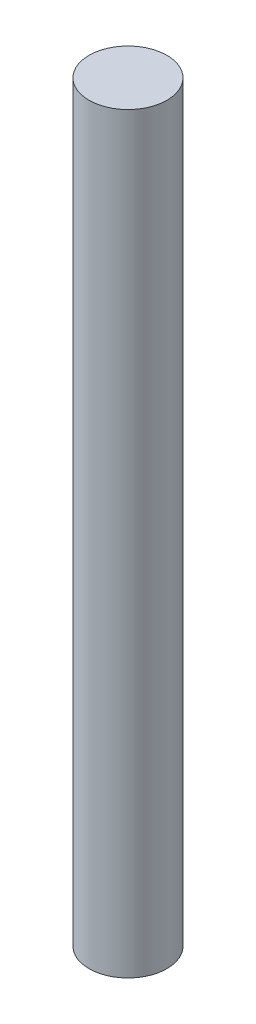
ISO-10303-21;
HEADER;
FILE_DESCRIPTION(('STEP AP214'),'2;1');
FILE_NAME('part.step','',(''),(''),'','','');
FILE_SCHEMA(('AUTOMOTIVE_DESIGN { 1 0 10303 214 1 1 1 1 }'));
ENDSEC;
DATA;
#1=APPLICATION_CONTEXT('core data for automotive mechanical design processes');
#2=APPLICATION_PROTOCOL_DEFINITION('international standard','automotive_design',2000,#1);
#3=PRODUCT_CONTEXT('',#1,'mechanical');
#4=PRODUCT('Part','Part','',(#3));
#5=PRODUCT_RELATED_PRODUCT_CATEGORY('part','',(#4));
#6=PRODUCT_DEFINITION_FORMATION('','',#4);
#7=PRODUCT_DEFINITION_CONTEXT('part definition',#1,'design');
#8=PRODUCT_DEFINITION('design','',#6,#7);
#9=PRODUCT_DEFINITION_SHAPE('','',#8);
#10=(LENGTH_UNIT() NAMED_UNIT(*) SI_UNIT(.MILLI.,.METRE.));
#11=(NAMED_UNIT(*) PLANE_ANGLE_UNIT() SI_UNIT($,.RADIAN.));
#12=(NAMED_UNIT(*) SI_UNIT($,.STERADIAN.) SOLID_ANGLE_UNIT());
#13=UNCERTAINTY_MEASURE_WITH_UNIT(LENGTH_MEASURE(1.E-05),#10,'distance_accuracy_value','');
#14=(GEOMETRIC_REPRESENTATION_CONTEXT(3) GLOBAL_UNCERTAINTY_ASSIGNED_CONTEXT((#13)) GLOBAL_UNIT_ASSIGNED_CONTEXT((#10,
#11,#12)) REPRESENTATION_CONTEXT('',''));
#15=CARTESIAN_POINT('',(0.,0.,0.));
#16=DIRECTION('',(0.,0.,1.));
#17=DIRECTION('',(1.,0.,0.));
#18=AXIS2_PLACEMENT_3D('',#15,#16,#17);
#19=CARTESIAN_POINT('',(0.,18.35,0.));
#20=DIRECTION('',(0.,-1.,0.));
#21=DIRECTION('',(0.,0.,-1.));
#22=AXIS2_PLACEMENT_3D('',#19,#20,#21);
#23=CYLINDRICAL_SURFACE('',#22,0.95);
#24=CARTESIAN_POINT('',(0.,18.35,0.));
#25=DIRECTION('',(0.,1.,0.));
#26=DIRECTION('',(0.,0.,1.));
#27=AXIS2_PLACEMENT_3D('',#24,#25,#26);
#28=CIRCLE('',#27,0.95);
#29=CARTESIAN_POINT('',(0.,18.35,0.95));
#30=VERTEX_POINT('',#29);
#31=EDGE_CURVE('E12',#30,#30,#28,.T.);
#32=ORIENTED_EDGE('',*,*,#31,.F.);
#33=EDGE_LOOP('',(#32));
#34=FACE_BOUND('',#33,.T.);
#35=CARTESIAN_POINT('',(0.,0.,0.));
#36=DIRECTION('',(0.,1.,0.));
#37=DIRECTION('',(0.,0.,1.));
#38=AXIS2_PLACEMENT_3D('',#35,#36,#37);
#39=CIRCLE('',#38,0.95);
#40=CARTESIAN_POINT('',(0.,0.,0.95));
#41=VERTEX_POINT('',#40);
#42=EDGE_CURVE('E57',#41,#41,#39,.T.);
#43=ORIENTED_EDGE('',*,*,#42,.T.);
#44=EDGE_LOOP('',(#43));
#45=FACE_BOUND('',#44,.T.);
#46=ADVANCED_FACE('F52',(#34,#45),#23,.T.);
#47=CARTESIAN_POINT('',(0.,18.35,0.));
#48=DIRECTION('',(0.,1.,0.));
#49=DIRECTION('',(0.,0.,1.));
#50=AXIS2_PLACEMENT_3D('',#47,#48,#49);
#51=PLANE('',#50);
#52=ORIENTED_EDGE('',*,*,#31,.T.);
#53=EDGE_LOOP('',(#52));
#54=FACE_BOUND('',#53,.T.);
#55=ADVANCED_FACE('F68',(#54),#51,.T.);
#56=CARTESIAN_POINT('',(0.,0.,0.));
#57=DIRECTION('',(0.,1.,0.));
#58=DIRECTION('',(0.,0.,1.));
#59=AXIS2_PLACEMENT_3D('',#56,#57,#58);
#60=PLANE('',#59);
#61=ORIENTED_EDGE('',*,*,#42,.F.);
#62=EDGE_LOOP('',(#61));
#63=FACE_BOUND('',#62,.T.);
#64=ADVANCED_FACE('F66',(#63),#60,.F.);
#65=CLOSED_SHELL('',(#46,#55,#64));
#66=MANIFOLD_SOLID_BREP('B2',#65);
#67=ADVANCED_BREP_SHAPE_REPRESENTATION('',(#18,#66),#14);
#68=SHAPE_DEFINITION_REPRESENTATION(#9,#67);
ENDSEC;
END-ISO-10303-21;
